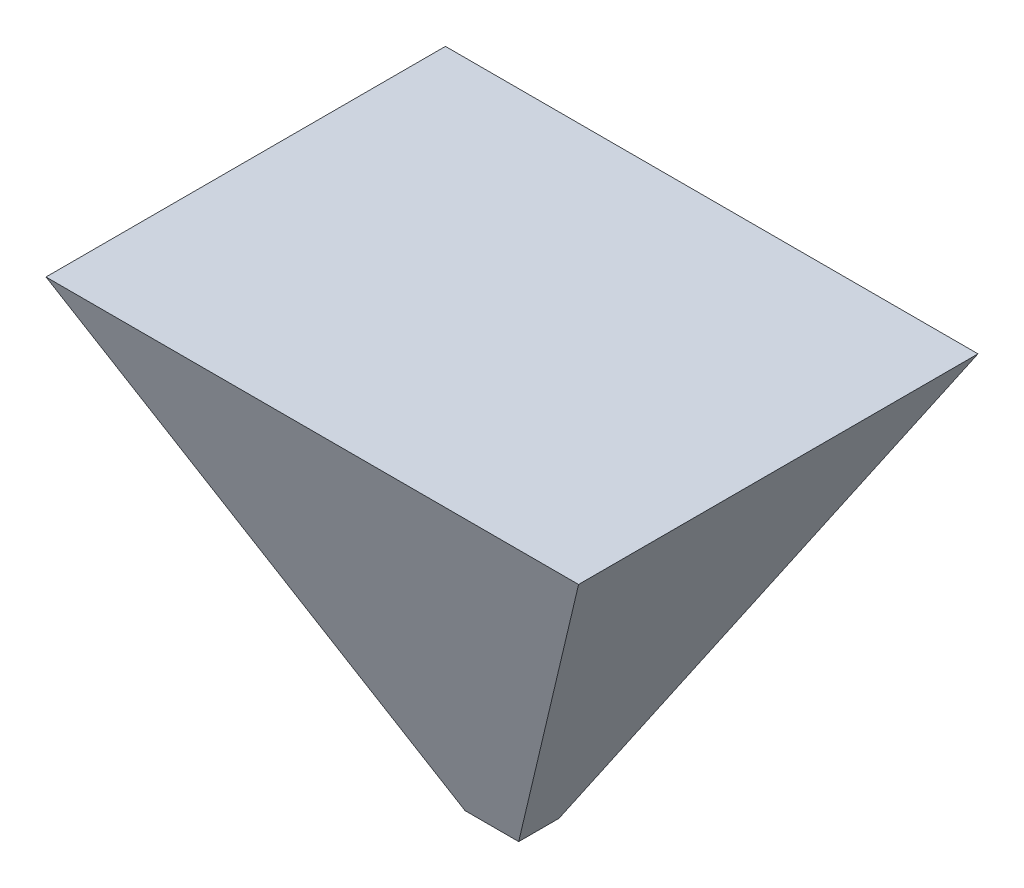
ISO-10303-21;
HEADER;
FILE_DESCRIPTION(('STEP AP214'),'2;1');
FILE_NAME('part.step','',(''),(''),'','','');
FILE_SCHEMA(('AUTOMOTIVE_DESIGN { 1 0 10303 214 1 1 1 1 }'));
ENDSEC;
DATA;
#1=APPLICATION_CONTEXT('core data for automotive mechanical design processes');
#2=APPLICATION_PROTOCOL_DEFINITION('international standard','automotive_design',2000,#1);
#3=PRODUCT_CONTEXT('',#1,'mechanical');
#4=PRODUCT('Part','Part','',(#3));
#5=PRODUCT_RELATED_PRODUCT_CATEGORY('part','',(#4));
#6=PRODUCT_DEFINITION_FORMATION('','',#4);
#7=PRODUCT_DEFINITION_CONTEXT('part definition',#1,'design');
#8=PRODUCT_DEFINITION('design','',#6,#7);
#9=PRODUCT_DEFINITION_SHAPE('','',#8);
#10=(LENGTH_UNIT() NAMED_UNIT(*) SI_UNIT(.MILLI.,.METRE.));
#11=(NAMED_UNIT(*) PLANE_ANGLE_UNIT() SI_UNIT($,.RADIAN.));
#12=(NAMED_UNIT(*) SI_UNIT($,.STERADIAN.) SOLID_ANGLE_UNIT());
#13=UNCERTAINTY_MEASURE_WITH_UNIT(LENGTH_MEASURE(1.E-05),#10,'distance_accuracy_value','');
#14=(GEOMETRIC_REPRESENTATION_CONTEXT(3) GLOBAL_UNCERTAINTY_ASSIGNED_CONTEXT((#13)) GLOBAL_UNIT_ASSIGNED_CONTEXT((#10,
#11,#12)) REPRESENTATION_CONTEXT('',''));
#15=CARTESIAN_POINT('',(0.,0.,0.));
#16=DIRECTION('',(0.,0.,1.));
#17=DIRECTION('',(1.,0.,0.));
#18=AXIS2_PLACEMENT_3D('',#15,#16,#17);
#19=CARTESIAN_POINT('',(-0.62,0.,-0.465));
#20=DIRECTION('',(0.,1.,0.));
#21=DIRECTION('',(0.,0.,1.));
#22=AXIS2_PLACEMENT_3D('',#19,#20,#21);
#23=PLANE('',#22);
#24=DIRECTION('',(1.,0.,0.));
#25=VECTOR('',#24,1.);
#26=CARTESIAN_POINT('',(0.,0.,0.465));
#27=LINE('',#26,#25);
#28=CARTESIAN_POINT('',(0.62,0.,0.465));
#29=VERTEX_POINT('',#28);
#30=CARTESIAN_POINT('',(-0.62,0.,0.465));
#31=VERTEX_POINT('',#30);
#32=EDGE_CURVE('E57',#29,#31,#27,.F.);
#33=ORIENTED_EDGE('',*,*,#32,.T.);
#34=DIRECTION('',(0.,0.,1.));
#35=VECTOR('',#34,1.);
#36=CARTESIAN_POINT('',(-0.619999999999999,0.,0.));
#37=LINE('',#36,#35);
#38=CARTESIAN_POINT('',(-0.62,0.,-0.465));
#39=VERTEX_POINT('',#38);
#40=EDGE_CURVE('E20',#31,#39,#37,.F.);
#41=ORIENTED_EDGE('',*,*,#40,.T.);
#42=DIRECTION('',(1.,0.,0.));
#43=VECTOR('',#42,1.);
#44=CARTESIAN_POINT('',(0.,0.,-0.465));
#45=LINE('',#44,#43);
#46=CARTESIAN_POINT('',(0.619999999999999,0.,-0.465));
#47=VERTEX_POINT('',#46);
#48=EDGE_CURVE('E80',#39,#47,#45,.T.);
#49=ORIENTED_EDGE('',*,*,#48,.T.);
#50=DIRECTION('',(0.,0.,1.));
#51=VECTOR('',#50,1.);
#52=CARTESIAN_POINT('',(0.619999999999999,0.,0.));
#53=LINE('',#52,#51);
#54=EDGE_CURVE('E55',#47,#29,#53,.T.);
#55=ORIENTED_EDGE('',*,*,#54,.T.);
#56=EDGE_LOOP('',(#33,#41,#49,#55));
#57=FACE_BOUND('',#56,.T.);
#58=ADVANCED_FACE('F17',(#57),#23,.F.);
#59=CARTESIAN_POINT('',(-0.474399272791824,-0.262817197126671,0.));
#60=DIRECTION('',(0.874734312466459,0.484602809106418,0.));
#61=DIRECTION('',(-0.484602809106418,0.874734312466459,0.));
#62=AXIS2_PLACEMENT_3D('',#59,#60,#61);
#63=PLANE('',#62);
#64=ORIENTED_EDGE('',*,*,#40,.F.);
#65=DIRECTION('',(-0.455453479509262,0.82211819406004,0.341590109631946));
#66=VECTOR('',#65,1.);
#67=CARTESIAN_POINT('',(-0.62,0.,0.465));
#68=LINE('',#67,#66);
#69=CARTESIAN_POINT('',(-6.16,10.,4.62));
#70=VERTEX_POINT('',#69);
#71=EDGE_CURVE('E63',#31,#70,#68,.T.);
#72=ORIENTED_EDGE('',*,*,#71,.T.);
#73=DIRECTION('',(0.,0.,1.));
#74=VECTOR('',#73,1.);
#75=CARTESIAN_POINT('',(-6.16,10.,-4.62));
#76=LINE('',#75,#74);
#77=CARTESIAN_POINT('',(-6.16,10.,-4.62));
#78=VERTEX_POINT('',#77);
#79=EDGE_CURVE('E83',#78,#70,#76,.T.);
#80=ORIENTED_EDGE('',*,*,#79,.F.);
#81=DIRECTION('',(0.455453479509262,-0.82211819406004,0.341590109631947));
#82=VECTOR('',#81,1.);
#83=CARTESIAN_POINT('',(-6.16,10.,-4.62));
#84=LINE('',#83,#82);
#85=EDGE_CURVE('E68',#78,#39,#84,.T.);
#86=ORIENTED_EDGE('',*,*,#85,.T.);
#87=EDGE_LOOP('',(#64,#72,#80,#86));
#88=FACE_BOUND('',#87,.T.);
#89=ADVANCED_FACE('F65',(#88),#63,.F.);
#90=CARTESIAN_POINT('',(0.,-0.164762807689741,0.396541053404913));
#91=DIRECTION('',(0.,0.383697199709229,-0.923458964402477));
#92=DIRECTION('',(0.,0.923458964402477,0.383697199709229));
#93=AXIS2_PLACEMENT_3D('',#90,#91,#92);
#94=PLANE('',#93);
#95=ORIENTED_EDGE('',*,*,#32,.F.);
#96=DIRECTION('',(0.455453479509262,0.82211819406004,0.341590109631946));
#97=VECTOR('',#96,1.);
#98=CARTESIAN_POINT('',(0.619999999999999,0.,0.465));
#99=LINE('',#98,#97);
#100=CARTESIAN_POINT('',(6.16,10.,4.62));
#101=VERTEX_POINT('',#100);
#102=EDGE_CURVE('E75',#29,#101,#99,.T.);
#103=ORIENTED_EDGE('',*,*,#102,.T.);
#104=DIRECTION('',(1.,0.,0.));
#105=VECTOR('',#104,1.);
#106=CARTESIAN_POINT('',(-6.16,10.,4.62));
#107=LINE('',#106,#105);
#108=EDGE_CURVE('E72',#70,#101,#107,.T.);
#109=ORIENTED_EDGE('',*,*,#108,.F.);
#110=ORIENTED_EDGE('',*,*,#71,.F.);
#111=EDGE_LOOP('',(#95,#103,#109,#110));
#112=FACE_BOUND('',#111,.T.);
#113=ADVANCED_FACE('F70',(#112),#94,.F.);
#114=CARTESIAN_POINT('',(0.474399272791824,-0.262817197126671,0.));
#115=DIRECTION('',(-0.874734312466459,0.484602809106418,0.));
#116=DIRECTION('',(-0.484602809106418,-0.874734312466459,0.));
#117=AXIS2_PLACEMENT_3D('',#114,#115,#116);
#118=PLANE('',#117);
#119=ORIENTED_EDGE('',*,*,#54,.F.);
#120=DIRECTION('',(0.455453479509262,0.82211819406004,-0.341590109631946));
#121=VECTOR('',#120,1.);
#122=CARTESIAN_POINT('',(0.619999999999999,0.,-0.465));
#123=LINE('',#122,#121);
#124=CARTESIAN_POINT('',(6.16,10.,-4.62));
#125=VERTEX_POINT('',#124);
#126=EDGE_CURVE('E35',#47,#125,#123,.T.);
#127=ORIENTED_EDGE('',*,*,#126,.T.);
#128=DIRECTION('',(0.,0.,1.));
#129=VECTOR('',#128,1.);
#130=CARTESIAN_POINT('',(6.16,10.,-4.62));
#131=LINE('',#130,#129);
#132=EDGE_CURVE('E26',#101,#125,#131,.F.);
#133=ORIENTED_EDGE('',*,*,#132,.F.);
#134=ORIENTED_EDGE('',*,*,#102,.F.);
#135=EDGE_LOOP('',(#119,#127,#133,#134));
#136=FACE_BOUND('',#135,.T.);
#137=ADVANCED_FACE('F89',(#136),#118,.F.);
#138=CARTESIAN_POINT('',(0.,-0.164762807689741,-0.396541053404913));
#139=DIRECTION('',(0.,0.383697199709229,0.923458964402477));
#140=DIRECTION('',(0.,-0.923458964402477,0.383697199709229));
#141=AXIS2_PLACEMENT_3D('',#138,#139,#140);
#142=PLANE('',#141);
#143=ORIENTED_EDGE('',*,*,#48,.F.);
#144=ORIENTED_EDGE('',*,*,#85,.F.);
#145=DIRECTION('',(1.,0.,0.));
#146=VECTOR('',#145,1.);
#147=CARTESIAN_POINT('',(-6.16,10.,-4.62));
#148=LINE('',#147,#146);
#149=EDGE_CURVE('E11',#125,#78,#148,.F.);
#150=ORIENTED_EDGE('',*,*,#149,.F.);
#151=ORIENTED_EDGE('',*,*,#126,.F.);
#152=EDGE_LOOP('',(#143,#144,#150,#151));
#153=FACE_BOUND('',#152,.T.);
#154=ADVANCED_FACE('F91',(#153),#142,.F.);
#155=CARTESIAN_POINT('',(-6.16,10.,-4.62));
#156=DIRECTION('',(0.,1.,0.));
#157=DIRECTION('',(0.,0.,1.));
#158=AXIS2_PLACEMENT_3D('',#155,#156,#157);
#159=PLANE('',#158);
#160=ORIENTED_EDGE('',*,*,#132,.T.);
#161=ORIENTED_EDGE('',*,*,#149,.T.);
#162=ORIENTED_EDGE('',*,*,#79,.T.);
#163=ORIENTED_EDGE('',*,*,#108,.T.);
#164=EDGE_LOOP('',(#160,#161,#162,#163));
#165=FACE_BOUND('',#164,.T.);
#166=ADVANCED_FACE('F88',(#165),#159,.T.);
#167=CLOSED_SHELL('',(#58,#89,#113,#137,#154,#166));
#168=MANIFOLD_SOLID_BREP('B1',#167);
#169=ADVANCED_BREP_SHAPE_REPRESENTATION('',(#18,#168),#14);
#170=SHAPE_DEFINITION_REPRESENTATION(#9,#169);
ENDSEC;
END-ISO-10303-21;
